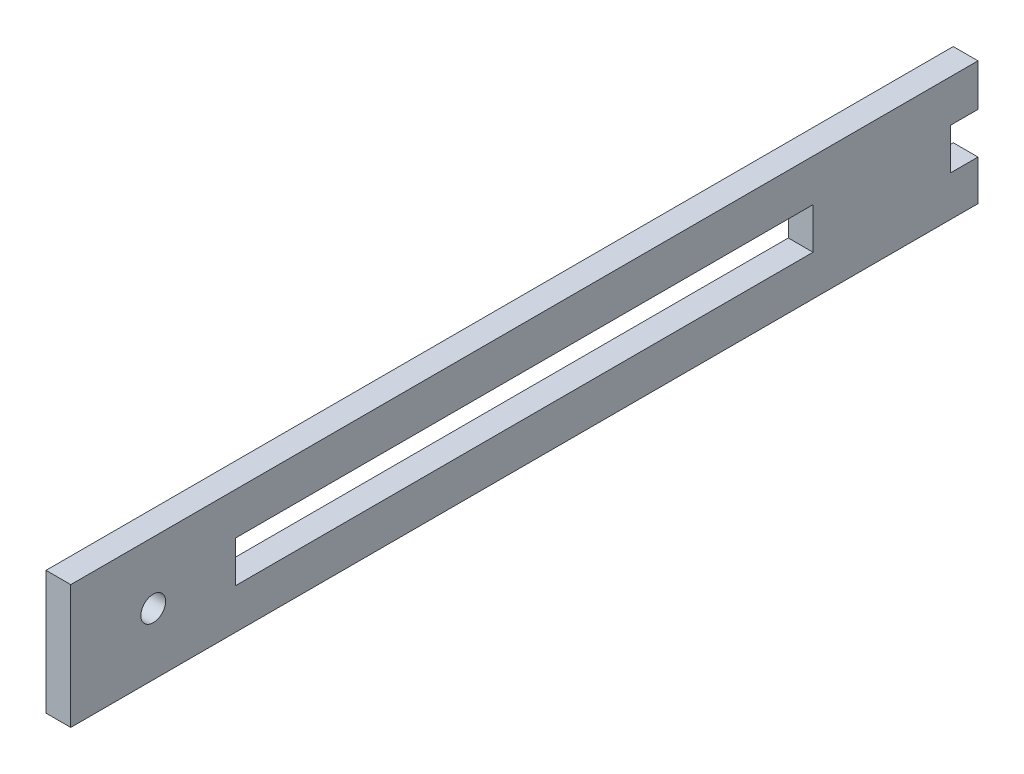
ISO-10303-21;
HEADER;
FILE_DESCRIPTION(('STEP AP214'),'2;1');
FILE_NAME('part.step','',(''),(''),'','','');
FILE_SCHEMA(('AUTOMOTIVE_DESIGN { 1 0 10303 214 1 1 1 1 }'));
ENDSEC;
DATA;
#1=APPLICATION_CONTEXT('core data for automotive mechanical design processes');
#2=APPLICATION_PROTOCOL_DEFINITION('international standard','automotive_design',2000,#1);
#3=PRODUCT_CONTEXT('',#1,'mechanical');
#4=PRODUCT('Part','Part','',(#3));
#5=PRODUCT_RELATED_PRODUCT_CATEGORY('part','',(#4));
#6=PRODUCT_DEFINITION_FORMATION('','',#4);
#7=PRODUCT_DEFINITION_CONTEXT('part definition',#1,'design');
#8=PRODUCT_DEFINITION('design','',#6,#7);
#9=PRODUCT_DEFINITION_SHAPE('','',#8);
#10=(LENGTH_UNIT() NAMED_UNIT(*) SI_UNIT(.MILLI.,.METRE.));
#11=(NAMED_UNIT(*) PLANE_ANGLE_UNIT() SI_UNIT($,.RADIAN.));
#12=(NAMED_UNIT(*) SI_UNIT($,.STERADIAN.) SOLID_ANGLE_UNIT());
#13=UNCERTAINTY_MEASURE_WITH_UNIT(LENGTH_MEASURE(1.E-05),#10,'distance_accuracy_value','');
#14=(GEOMETRIC_REPRESENTATION_CONTEXT(3) GLOBAL_UNCERTAINTY_ASSIGNED_CONTEXT((#13)) GLOBAL_UNIT_ASSIGNED_CONTEXT((#10,
#11,#12)) REPRESENTATION_CONTEXT('',''));
#15=CARTESIAN_POINT('',(0.,0.,0.));
#16=DIRECTION('',(0.,0.,1.));
#17=DIRECTION('',(1.,0.,0.));
#18=AXIS2_PLACEMENT_3D('',#15,#16,#17);
#19=CARTESIAN_POINT('',(3.,-7.49999999999999,-55.));
#20=DIRECTION('',(0.,0.,1.));
#21=DIRECTION('',(1.,0.,0.));
#22=AXIS2_PLACEMENT_3D('',#19,#20,#21);
#23=PLANE('',#22);
#24=DIRECTION('',(0.,1.,0.));
#25=VECTOR('',#24,1.);
#26=CARTESIAN_POINT('',(0.,-7.49999999999999,-55.));
#27=LINE('',#26,#25);
#28=CARTESIAN_POINT('',(0.,-7.49999999999999,-55.));
#29=VERTEX_POINT('',#28);
#30=CARTESIAN_POINT('',(0.,-2.60154627986538,-55.));
#31=VERTEX_POINT('',#30);
#32=EDGE_CURVE('E209',#29,#31,#27,.T.);
#33=ORIENTED_EDGE('',*,*,#32,.T.);
#34=DIRECTION('',(1.,0.,0.));
#35=VECTOR('',#34,1.);
#36=CARTESIAN_POINT('',(0.,-2.60154627986538,-55.));
#37=LINE('',#36,#35);
#38=CARTESIAN_POINT('',(3.,-2.60154627986538,-55.));
#39=VERTEX_POINT('',#38);
#40=EDGE_CURVE('E151',#31,#39,#37,.T.);
#41=ORIENTED_EDGE('',*,*,#40,.T.);
#42=DIRECTION('',(0.,1.,0.));
#43=VECTOR('',#42,1.);
#44=CARTESIAN_POINT('',(3.,-7.49999999999999,-55.));
#45=LINE('',#44,#43);
#46=CARTESIAN_POINT('',(3.,-7.49999999999999,-55.));
#47=VERTEX_POINT('',#46);
#48=EDGE_CURVE('E199',#47,#39,#45,.T.);
#49=ORIENTED_EDGE('',*,*,#48,.F.);
#50=DIRECTION('',(-1.,0.,0.));
#51=VECTOR('',#50,1.);
#52=CARTESIAN_POINT('',(3.,-7.49999999999999,-55.));
#53=LINE('',#52,#51);
#54=EDGE_CURVE('E40',#47,#29,#53,.T.);
#55=ORIENTED_EDGE('',*,*,#54,.T.);
#56=EDGE_LOOP('',(#33,#41,#49,#55));
#57=FACE_BOUND('',#56,.T.);
#58=ADVANCED_FACE('F32',(#57),#23,.F.);
#59=CARTESIAN_POINT('',(3.,0.,0.));
#60=DIRECTION('',(1.,0.,0.));
#61=DIRECTION('',(0.,0.,-1.));
#62=AXIS2_PLACEMENT_3D('',#59,#60,#61);
#63=PLANE('',#62);
#64=DIRECTION('',(0.,0.,-1.));
#65=VECTOR('',#64,1.);
#66=CARTESIAN_POINT('',(3.,-2.60154627986538,-51.676173746455));
#67=LINE('',#66,#65);
#68=CARTESIAN_POINT('',(3.,-2.60154627986538,-51.676173746455));
#69=VERTEX_POINT('',#68);
#70=EDGE_CURVE('E143',#69,#39,#67,.T.);
#71=ORIENTED_EDGE('',*,*,#70,.F.);
#72=DIRECTION('',(0.,-1.,0.));
#73=VECTOR('',#72,1.);
#74=CARTESIAN_POINT('',(3.,2.39845372013462,-51.676173746455));
#75=LINE('',#74,#73);
#76=CARTESIAN_POINT('',(3.,2.39845372013462,-51.676173746455));
#77=VERTEX_POINT('',#76);
#78=EDGE_CURVE('E145',#77,#69,#75,.T.);
#79=ORIENTED_EDGE('',*,*,#78,.F.);
#80=DIRECTION('',(0.,0.,1.));
#81=VECTOR('',#80,1.);
#82=CARTESIAN_POINT('',(3.,2.39845372013462,-55.));
#83=LINE('',#82,#81);
#84=CARTESIAN_POINT('',(3.,2.39845372013462,-55.));
#85=VERTEX_POINT('',#84);
#86=EDGE_CURVE('E123',#85,#77,#83,.T.);
#87=ORIENTED_EDGE('',*,*,#86,.F.);
#88=CARTESIAN_POINT('',(3.,7.50000000000001,-55.));
#89=VERTEX_POINT('',#88);
#90=EDGE_CURVE('E198',#85,#89,#45,.T.);
#91=ORIENTED_EDGE('',*,*,#90,.T.);
#92=DIRECTION('',(0.,0.,1.));
#93=VECTOR('',#92,1.);
#94=CARTESIAN_POINT('',(3.,7.50000000000001,-55.));
#95=LINE('',#94,#93);
#96=CARTESIAN_POINT('',(3.,7.49999999999999,55.));
#97=VERTEX_POINT('',#96);
#98=EDGE_CURVE('E202',#89,#97,#95,.T.);
#99=ORIENTED_EDGE('',*,*,#98,.T.);
#100=DIRECTION('',(0.,-1.,0.));
#101=VECTOR('',#100,1.);
#102=CARTESIAN_POINT('',(3.,-7.50000000000001,55.));
#103=LINE('',#102,#101);
#104=CARTESIAN_POINT('',(3.,-7.50000000000001,55.));
#105=VERTEX_POINT('',#104);
#106=EDGE_CURVE('E192',#97,#105,#103,.T.);
#107=ORIENTED_EDGE('',*,*,#106,.T.);
#108=DIRECTION('',(0.,0.,-1.));
#109=VECTOR('',#108,1.);
#110=CARTESIAN_POINT('',(3.,-7.49999999999999,-55.));
#111=LINE('',#110,#109);
#112=EDGE_CURVE('E195',#105,#47,#111,.T.);
#113=ORIENTED_EDGE('',*,*,#112,.T.);
#114=ORIENTED_EDGE('',*,*,#48,.T.);
#115=EDGE_LOOP('',(#71,#79,#87,#91,#99,#107,#113,#114));
#116=FACE_BOUND('',#115,.T.);
#117=CARTESIAN_POINT('',(3.,0.,45.));
#118=DIRECTION('',(1.,0.,0.));
#119=DIRECTION('',(0.,0.,-1.));
#120=AXIS2_PLACEMENT_3D('',#117,#118,#119);
#121=CIRCLE('',#120,1.5);
#122=CARTESIAN_POINT('',(3.,0.,43.5));
#123=VERTEX_POINT('',#122);
#124=EDGE_CURVE('E154',#123,#123,#121,.T.);
#125=ORIENTED_EDGE('',*,*,#124,.F.);
#126=EDGE_LOOP('',(#125));
#127=FACE_BOUND('',#126,.T.);
#128=DIRECTION('',(0.,0.,-1.));
#129=VECTOR('',#128,1.);
#130=CARTESIAN_POINT('',(3.,-2.60154627986538,-35.));
#131=LINE('',#130,#129);
#132=CARTESIAN_POINT('',(3.,-2.60154627986539,35.));
#133=VERTEX_POINT('',#132);
#134=CARTESIAN_POINT('',(3.,-2.60154627986538,-35.));
#135=VERTEX_POINT('',#134);
#136=EDGE_CURVE('E165',#133,#135,#131,.T.);
#137=ORIENTED_EDGE('',*,*,#136,.F.);
#138=DIRECTION('',(0.,-1.,0.));
#139=VECTOR('',#138,1.);
#140=CARTESIAN_POINT('',(3.,-2.60154627986539,35.));
#141=LINE('',#140,#139);
#142=CARTESIAN_POINT('',(3.,2.39845372013461,35.));
#143=VERTEX_POINT('',#142);
#144=EDGE_CURVE('E163',#143,#133,#141,.T.);
#145=ORIENTED_EDGE('',*,*,#144,.F.);
#146=DIRECTION('',(0.,0.,1.));
#147=VECTOR('',#146,1.);
#148=CARTESIAN_POINT('',(3.,2.39845372013462,-35.));
#149=LINE('',#148,#147);
#150=CARTESIAN_POINT('',(3.,2.39845372013462,-35.));
#151=VERTEX_POINT('',#150);
#152=EDGE_CURVE('E170',#151,#143,#149,.T.);
#153=ORIENTED_EDGE('',*,*,#152,.F.);
#154=DIRECTION('',(0.,1.,0.));
#155=VECTOR('',#154,1.);
#156=CARTESIAN_POINT('',(3.,-2.60154627986538,-35.));
#157=LINE('',#156,#155);
#158=EDGE_CURVE('E168',#135,#151,#157,.T.);
#159=ORIENTED_EDGE('',*,*,#158,.F.);
#160=EDGE_LOOP('',(#137,#145,#153,#159));
#161=FACE_BOUND('',#160,.T.);
#162=ADVANCED_FACE('F228',(#116,#127,#161),#63,.T.);
#163=CARTESIAN_POINT('',(0.,0.,0.));
#164=DIRECTION('',(1.,0.,0.));
#165=DIRECTION('',(0.,0.,-1.));
#166=AXIS2_PLACEMENT_3D('',#163,#164,#165);
#167=PLANE('',#166);
#168=CARTESIAN_POINT('',(0.,0.,45.));
#169=DIRECTION('',(1.,0.,0.));
#170=DIRECTION('',(0.,0.,-1.));
#171=AXIS2_PLACEMENT_3D('',#168,#169,#170);
#172=CIRCLE('',#171,1.5);
#173=CARTESIAN_POINT('',(0.,0.,43.5));
#174=VERTEX_POINT('',#173);
#175=EDGE_CURVE('E157',#174,#174,#172,.T.);
#176=ORIENTED_EDGE('',*,*,#175,.T.);
#177=EDGE_LOOP('',(#176));
#178=FACE_BOUND('',#177,.T.);
#179=DIRECTION('',(0.,-1.,0.));
#180=VECTOR('',#179,1.);
#181=CARTESIAN_POINT('',(0.,2.39845372013462,-51.676173746455));
#182=LINE('',#181,#180);
#183=CARTESIAN_POINT('',(0.,2.39845372013462,-51.676173746455));
#184=VERTEX_POINT('',#183);
#185=CARTESIAN_POINT('',(0.,-2.60154627986538,-51.676173746455));
#186=VERTEX_POINT('',#185);
#187=EDGE_CURVE('E131',#184,#186,#182,.T.);
#188=ORIENTED_EDGE('',*,*,#187,.T.);
#189=DIRECTION('',(0.,0.,-1.));
#190=VECTOR('',#189,1.);
#191=CARTESIAN_POINT('',(0.,-2.60154627986538,-51.676173746455));
#192=LINE('',#191,#190);
#193=EDGE_CURVE('E136',#186,#31,#192,.T.);
#194=ORIENTED_EDGE('',*,*,#193,.T.);
#195=ORIENTED_EDGE('',*,*,#32,.F.);
#196=DIRECTION('',(0.,0.,-1.));
#197=VECTOR('',#196,1.);
#198=CARTESIAN_POINT('',(0.,-7.49999999999999,-55.));
#199=LINE('',#198,#197);
#200=CARTESIAN_POINT('',(0.,-7.50000000000001,55.));
#201=VERTEX_POINT('',#200);
#202=EDGE_CURVE('E207',#201,#29,#199,.T.);
#203=ORIENTED_EDGE('',*,*,#202,.F.);
#204=DIRECTION('',(0.,-1.,0.));
#205=VECTOR('',#204,1.);
#206=CARTESIAN_POINT('',(0.,-7.50000000000001,55.));
#207=LINE('',#206,#205);
#208=CARTESIAN_POINT('',(0.,7.49999999999999,55.));
#209=VERTEX_POINT('',#208);
#210=EDGE_CURVE('E191',#209,#201,#207,.T.);
#211=ORIENTED_EDGE('',*,*,#210,.F.);
#212=DIRECTION('',(0.,0.,1.));
#213=VECTOR('',#212,1.);
#214=CARTESIAN_POINT('',(0.,7.50000000000001,-55.));
#215=LINE('',#214,#213);
#216=CARTESIAN_POINT('',(0.,7.50000000000001,-55.));
#217=VERTEX_POINT('',#216);
#218=EDGE_CURVE('E196',#217,#209,#215,.T.);
#219=ORIENTED_EDGE('',*,*,#218,.F.);
#220=CARTESIAN_POINT('',(0.,2.39845372013462,-55.));
#221=VERTEX_POINT('',#220);
#222=EDGE_CURVE('E142',#221,#217,#27,.T.);
#223=ORIENTED_EDGE('',*,*,#222,.F.);
#224=DIRECTION('',(0.,0.,1.));
#225=VECTOR('',#224,1.);
#226=CARTESIAN_POINT('',(0.,2.39845372013462,-55.));
#227=LINE('',#226,#225);
#228=EDGE_CURVE('E47',#221,#184,#227,.T.);
#229=ORIENTED_EDGE('',*,*,#228,.T.);
#230=EDGE_LOOP('',(#188,#194,#195,#203,#211,#219,#223,#229));
#231=FACE_BOUND('',#230,.T.);
#232=DIRECTION('',(0.,-1.,0.));
#233=VECTOR('',#232,1.);
#234=CARTESIAN_POINT('',(0.,-2.60154627986539,35.));
#235=LINE('',#234,#233);
#236=CARTESIAN_POINT('',(0.,2.39845372013461,35.));
#237=VERTEX_POINT('',#236);
#238=CARTESIAN_POINT('',(0.,-2.60154627986539,35.));
#239=VERTEX_POINT('',#238);
#240=EDGE_CURVE('E160',#237,#239,#235,.T.);
#241=ORIENTED_EDGE('',*,*,#240,.T.);
#242=DIRECTION('',(0.,0.,-1.));
#243=VECTOR('',#242,1.);
#244=CARTESIAN_POINT('',(0.,-2.60154627986538,-35.));
#245=LINE('',#244,#243);
#246=CARTESIAN_POINT('',(0.,-2.60154627986538,-35.));
#247=VERTEX_POINT('',#246);
#248=EDGE_CURVE('E175',#239,#247,#245,.T.);
#249=ORIENTED_EDGE('',*,*,#248,.T.);
#250=DIRECTION('',(0.,1.,0.));
#251=VECTOR('',#250,1.);
#252=CARTESIAN_POINT('',(0.,-2.60154627986538,-35.));
#253=LINE('',#252,#251);
#254=CARTESIAN_POINT('',(0.,2.39845372013462,-35.));
#255=VERTEX_POINT('',#254);
#256=EDGE_CURVE('E178',#247,#255,#253,.T.);
#257=ORIENTED_EDGE('',*,*,#256,.T.);
#258=DIRECTION('',(0.,0.,1.));
#259=VECTOR('',#258,1.);
#260=CARTESIAN_POINT('',(0.,2.39845372013462,-35.));
#261=LINE('',#260,#259);
#262=EDGE_CURVE('E166',#255,#237,#261,.T.);
#263=ORIENTED_EDGE('',*,*,#262,.T.);
#264=EDGE_LOOP('',(#241,#249,#257,#263));
#265=FACE_BOUND('',#264,.T.);
#266=ADVANCED_FACE('F139',(#178,#231,#265),#167,.F.);
#267=CARTESIAN_POINT('',(3.,-7.50000000000001,55.));
#268=DIRECTION('',(0.,0.,-1.));
#269=DIRECTION('',(-1.,0.,0.));
#270=AXIS2_PLACEMENT_3D('',#267,#268,#269);
#271=PLANE('',#270);
#272=ORIENTED_EDGE('',*,*,#210,.T.);
#273=DIRECTION('',(-1.,0.,0.));
#274=VECTOR('',#273,1.);
#275=CARTESIAN_POINT('',(3.,-7.50000000000001,55.));
#276=LINE('',#275,#274);
#277=EDGE_CURVE('E11',#105,#201,#276,.T.);
#278=ORIENTED_EDGE('',*,*,#277,.F.);
#279=ORIENTED_EDGE('',*,*,#106,.F.);
#280=DIRECTION('',(-1.,0.,0.));
#281=VECTOR('',#280,1.);
#282=CARTESIAN_POINT('',(3.,7.49999999999999,55.));
#283=LINE('',#282,#281);
#284=EDGE_CURVE('E204',#97,#209,#283,.T.);
#285=ORIENTED_EDGE('',*,*,#284,.T.);
#286=EDGE_LOOP('',(#272,#278,#279,#285));
#287=FACE_BOUND('',#286,.T.);
#288=ADVANCED_FACE('F34',(#287),#271,.F.);
#289=CARTESIAN_POINT('',(3.,-7.49999999999999,-55.));
#290=DIRECTION('',(0.,1.,0.));
#291=DIRECTION('',(0.,0.,1.));
#292=AXIS2_PLACEMENT_3D('',#289,#290,#291);
#293=PLANE('',#292);
#294=ORIENTED_EDGE('',*,*,#202,.T.);
#295=ORIENTED_EDGE('',*,*,#54,.F.);
#296=ORIENTED_EDGE('',*,*,#112,.F.);
#297=ORIENTED_EDGE('',*,*,#277,.T.);
#298=EDGE_LOOP('',(#294,#295,#296,#297));
#299=FACE_BOUND('',#298,.T.);
#300=ADVANCED_FACE('F232',(#299),#293,.F.);
#301=ORIENTED_EDGE('',*,*,#90,.F.);
#302=DIRECTION('',(1.,0.,0.));
#303=VECTOR('',#302,1.);
#304=CARTESIAN_POINT('',(0.,2.39845372013462,-55.));
#305=LINE('',#304,#303);
#306=EDGE_CURVE('E128',#221,#85,#305,.T.);
#307=ORIENTED_EDGE('',*,*,#306,.F.);
#308=ORIENTED_EDGE('',*,*,#222,.T.);
#309=DIRECTION('',(-1.,0.,0.));
#310=VECTOR('',#309,1.);
#311=CARTESIAN_POINT('',(3.,7.50000000000001,-55.));
#312=LINE('',#311,#310);
#313=EDGE_CURVE('E215',#89,#217,#312,.T.);
#314=ORIENTED_EDGE('',*,*,#313,.F.);
#315=EDGE_LOOP('',(#301,#307,#308,#314));
#316=FACE_BOUND('',#315,.T.);
#317=ADVANCED_FACE('F241',(#316),#23,.F.);
#318=CARTESIAN_POINT('',(3.,7.50000000000001,-55.));
#319=DIRECTION('',(0.,-1.,0.));
#320=DIRECTION('',(0.,0.,-1.));
#321=AXIS2_PLACEMENT_3D('',#318,#319,#320);
#322=PLANE('',#321);
#323=ORIENTED_EDGE('',*,*,#218,.T.);
#324=ORIENTED_EDGE('',*,*,#284,.F.);
#325=ORIENTED_EDGE('',*,*,#98,.F.);
#326=ORIENTED_EDGE('',*,*,#313,.T.);
#327=EDGE_LOOP('',(#323,#324,#325,#326));
#328=FACE_BOUND('',#327,.T.);
#329=ADVANCED_FACE('F236',(#328),#322,.F.);
#330=CARTESIAN_POINT('',(3.,-2.60154627986539,35.));
#331=DIRECTION('',(0.,0.,-1.));
#332=DIRECTION('',(-1.,0.,0.));
#333=AXIS2_PLACEMENT_3D('',#330,#331,#332);
#334=PLANE('',#333);
#335=ORIENTED_EDGE('',*,*,#240,.F.);
#336=DIRECTION('',(-1.,0.,0.));
#337=VECTOR('',#336,1.);
#338=CARTESIAN_POINT('',(3.,2.39845372013461,35.));
#339=LINE('',#338,#337);
#340=EDGE_CURVE('E172',#143,#237,#339,.T.);
#341=ORIENTED_EDGE('',*,*,#340,.F.);
#342=ORIENTED_EDGE('',*,*,#144,.T.);
#343=DIRECTION('',(-1.,0.,0.));
#344=VECTOR('',#343,1.);
#345=CARTESIAN_POINT('',(3.,-2.60154627986539,35.));
#346=LINE('',#345,#344);
#347=EDGE_CURVE('E188',#133,#239,#346,.T.);
#348=ORIENTED_EDGE('',*,*,#347,.T.);
#349=EDGE_LOOP('',(#335,#341,#342,#348));
#350=FACE_BOUND('',#349,.T.);
#351=ADVANCED_FACE('F248',(#350),#334,.T.);
#352=CARTESIAN_POINT('',(3.,-2.60154627986538,-35.));
#353=DIRECTION('',(0.,1.,0.));
#354=DIRECTION('',(0.,0.,1.));
#355=AXIS2_PLACEMENT_3D('',#352,#353,#354);
#356=PLANE('',#355);
#357=ORIENTED_EDGE('',*,*,#248,.F.);
#358=ORIENTED_EDGE('',*,*,#347,.F.);
#359=ORIENTED_EDGE('',*,*,#136,.T.);
#360=DIRECTION('',(-1.,0.,0.));
#361=VECTOR('',#360,1.);
#362=CARTESIAN_POINT('',(3.,-2.60154627986538,-35.));
#363=LINE('',#362,#361);
#364=EDGE_CURVE('E186',#135,#247,#363,.T.);
#365=ORIENTED_EDGE('',*,*,#364,.T.);
#366=EDGE_LOOP('',(#357,#358,#359,#365));
#367=FACE_BOUND('',#366,.T.);
#368=ADVANCED_FACE('F263',(#367),#356,.T.);
#369=CARTESIAN_POINT('',(3.,-2.60154627986538,-35.));
#370=DIRECTION('',(0.,0.,1.));
#371=DIRECTION('',(1.,0.,0.));
#372=AXIS2_PLACEMENT_3D('',#369,#370,#371);
#373=PLANE('',#372);
#374=ORIENTED_EDGE('',*,*,#256,.F.);
#375=ORIENTED_EDGE('',*,*,#364,.F.);
#376=ORIENTED_EDGE('',*,*,#158,.T.);
#377=DIRECTION('',(-1.,0.,0.));
#378=VECTOR('',#377,1.);
#379=CARTESIAN_POINT('',(3.,2.39845372013462,-35.));
#380=LINE('',#379,#378);
#381=EDGE_CURVE('E55',#151,#255,#380,.T.);
#382=ORIENTED_EDGE('',*,*,#381,.T.);
#383=EDGE_LOOP('',(#374,#375,#376,#382));
#384=FACE_BOUND('',#383,.T.);
#385=ADVANCED_FACE('F267',(#384),#373,.T.);
#386=CARTESIAN_POINT('',(3.,2.39845372013462,-35.));
#387=DIRECTION('',(0.,-1.,0.));
#388=DIRECTION('',(0.,0.,-1.));
#389=AXIS2_PLACEMENT_3D('',#386,#387,#388);
#390=PLANE('',#389);
#391=ORIENTED_EDGE('',*,*,#262,.F.);
#392=ORIENTED_EDGE('',*,*,#381,.F.);
#393=ORIENTED_EDGE('',*,*,#152,.T.);
#394=ORIENTED_EDGE('',*,*,#340,.T.);
#395=EDGE_LOOP('',(#391,#392,#393,#394));
#396=FACE_BOUND('',#395,.T.);
#397=ADVANCED_FACE('F271',(#396),#390,.T.);
#398=CARTESIAN_POINT('',(0.,0.,45.));
#399=DIRECTION('',(1.,0.,0.));
#400=DIRECTION('',(0.,0.,-1.));
#401=AXIS2_PLACEMENT_3D('',#398,#399,#400);
#402=CYLINDRICAL_SURFACE('',#401,1.5);
#403=ORIENTED_EDGE('',*,*,#175,.F.);
#404=EDGE_LOOP('',(#403));
#405=FACE_BOUND('',#404,.T.);
#406=ORIENTED_EDGE('',*,*,#124,.T.);
#407=EDGE_LOOP('',(#406));
#408=FACE_BOUND('',#407,.T.);
#409=ADVANCED_FACE('F275',(#405,#408),#402,.F.);
#410=CARTESIAN_POINT('',(0.,-2.60154627986538,-51.676173746455));
#411=DIRECTION('',(0.,-1.,0.));
#412=DIRECTION('',(0.,0.,-1.));
#413=AXIS2_PLACEMENT_3D('',#410,#411,#412);
#414=PLANE('',#413);
#415=ORIENTED_EDGE('',*,*,#70,.T.);
#416=ORIENTED_EDGE('',*,*,#40,.F.);
#417=ORIENTED_EDGE('',*,*,#193,.F.);
#418=DIRECTION('',(1.,0.,0.));
#419=VECTOR('',#418,1.);
#420=CARTESIAN_POINT('',(0.,-2.60154627986538,-51.676173746455));
#421=LINE('',#420,#419);
#422=EDGE_CURVE('E127',#186,#69,#421,.T.);
#423=ORIENTED_EDGE('',*,*,#422,.T.);
#424=EDGE_LOOP('',(#415,#416,#417,#423));
#425=FACE_BOUND('',#424,.T.);
#426=ADVANCED_FACE('F225',(#425),#414,.F.);
#427=CARTESIAN_POINT('',(0.,2.39845372013462,-51.676173746455));
#428=DIRECTION('',(0.,0.,1.));
#429=DIRECTION('',(1.,0.,0.));
#430=AXIS2_PLACEMENT_3D('',#427,#428,#429);
#431=PLANE('',#430);
#432=ORIENTED_EDGE('',*,*,#78,.T.);
#433=ORIENTED_EDGE('',*,*,#422,.F.);
#434=ORIENTED_EDGE('',*,*,#187,.F.);
#435=DIRECTION('',(1.,0.,0.));
#436=VECTOR('',#435,1.);
#437=CARTESIAN_POINT('',(0.,2.39845372013462,-51.676173746455));
#438=LINE('',#437,#436);
#439=EDGE_CURVE('E119',#184,#77,#438,.T.);
#440=ORIENTED_EDGE('',*,*,#439,.T.);
#441=EDGE_LOOP('',(#432,#433,#434,#440));
#442=FACE_BOUND('',#441,.T.);
#443=ADVANCED_FACE('F132',(#442),#431,.F.);
#444=CARTESIAN_POINT('',(0.,2.39845372013462,-55.));
#445=DIRECTION('',(0.,1.,0.));
#446=DIRECTION('',(0.,0.,1.));
#447=AXIS2_PLACEMENT_3D('',#444,#445,#446);
#448=PLANE('',#447);
#449=ORIENTED_EDGE('',*,*,#86,.T.);
#450=ORIENTED_EDGE('',*,*,#439,.F.);
#451=ORIENTED_EDGE('',*,*,#228,.F.);
#452=ORIENTED_EDGE('',*,*,#306,.T.);
#453=EDGE_LOOP('',(#449,#450,#451,#452));
#454=FACE_BOUND('',#453,.T.);
#455=ADVANCED_FACE('F121',(#454),#448,.F.);
#456=CLOSED_SHELL('',(#58,#162,#266,#288,#300,#317,#329,#351,#368,#385,#397,#409,#426,#443,#455));
#457=MANIFOLD_SOLID_BREP('B2',#456);
#458=ADVANCED_BREP_SHAPE_REPRESENTATION('',(#18,#457),#14);
#459=SHAPE_DEFINITION_REPRESENTATION(#9,#458);
ENDSEC;
END-ISO-10303-21;
